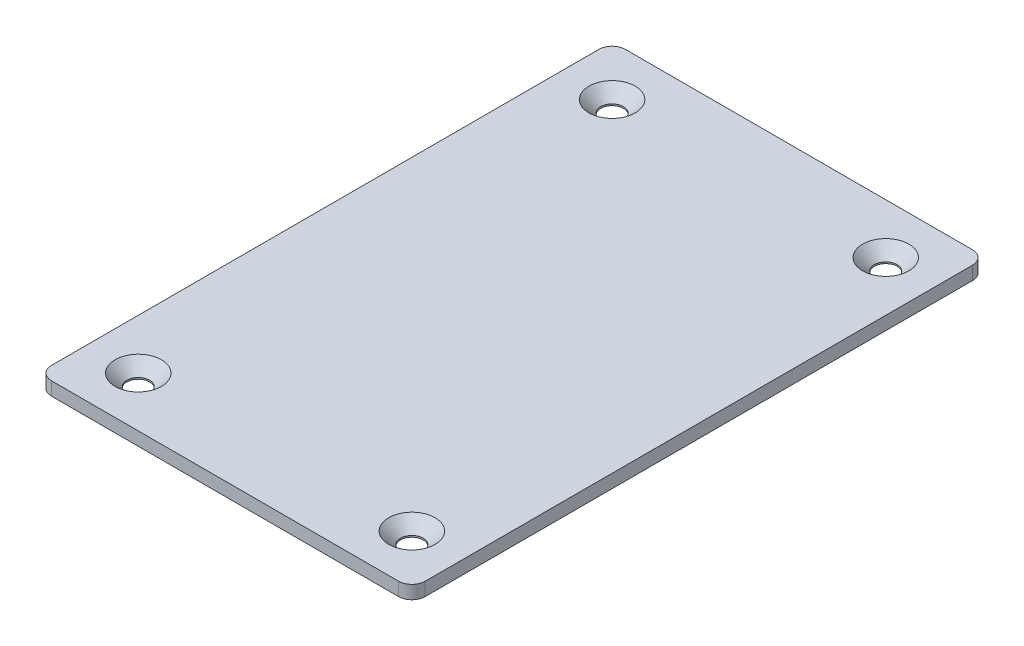
ISO-10303-21;
HEADER;
FILE_DESCRIPTION(('STEP AP214'),'2;1');
FILE_NAME('part.step','',(''),(''),'','','');
FILE_SCHEMA(('AUTOMOTIVE_DESIGN { 1 0 10303 214 1 1 1 1 }'));
ENDSEC;
DATA;
#1=APPLICATION_CONTEXT('core data for automotive mechanical design processes');
#2=APPLICATION_PROTOCOL_DEFINITION('international standard','automotive_design',2000,#1);
#3=PRODUCT_CONTEXT('',#1,'mechanical');
#4=PRODUCT('Part','Part','',(#3));
#5=PRODUCT_RELATED_PRODUCT_CATEGORY('part','',(#4));
#6=PRODUCT_DEFINITION_FORMATION('','',#4);
#7=PRODUCT_DEFINITION_CONTEXT('part definition',#1,'design');
#8=PRODUCT_DEFINITION('design','',#6,#7);
#9=PRODUCT_DEFINITION_SHAPE('','',#8);
#10=(LENGTH_UNIT() NAMED_UNIT(*) SI_UNIT(.MILLI.,.METRE.));
#11=(NAMED_UNIT(*) PLANE_ANGLE_UNIT() SI_UNIT($,.RADIAN.));
#12=(NAMED_UNIT(*) SI_UNIT($,.STERADIAN.) SOLID_ANGLE_UNIT());
#13=UNCERTAINTY_MEASURE_WITH_UNIT(LENGTH_MEASURE(1.E-05),#10,'distance_accuracy_value','');
#14=(GEOMETRIC_REPRESENTATION_CONTEXT(3) GLOBAL_UNCERTAINTY_ASSIGNED_CONTEXT((#13)) GLOBAL_UNIT_ASSIGNED_CONTEXT((#10,
#11,#12)) REPRESENTATION_CONTEXT('',''));
#15=CARTESIAN_POINT('',(0.,0.,0.));
#16=DIRECTION('',(0.,0.,1.));
#17=DIRECTION('',(1.,0.,0.));
#18=AXIS2_PLACEMENT_3D('',#15,#16,#17);
#19=CARTESIAN_POINT('',(0.,2.,0.));
#20=DIRECTION('',(0.,-1.,0.));
#21=DIRECTION('',(0.,0.,-1.));
#22=AXIS2_PLACEMENT_3D('',#19,#20,#21);
#23=PLANE('',#22);
#24=CARTESIAN_POINT('',(7.5,2.,-7.5));
#25=DIRECTION('',(0.,1.,0.));
#26=DIRECTION('',(0.,0.,1.));
#27=AXIS2_PLACEMENT_3D('',#24,#25,#26);
#28=CIRCLE('',#27,3.47);
#29=CARTESIAN_POINT('',(7.5,2.,-4.03));
#30=VERTEX_POINT('',#29);
#31=EDGE_CURVE('E213',#30,#30,#28,.T.);
#32=ORIENTED_EDGE('',*,*,#31,.F.);
#33=EDGE_LOOP('',(#32));
#34=FACE_BOUND('',#33,.T.);
#35=CARTESIAN_POINT('',(48.5,2.,-78.5));
#36=DIRECTION('',(0.,1.,0.));
#37=DIRECTION('',(0.,0.,1.));
#38=AXIS2_PLACEMENT_3D('',#35,#36,#37);
#39=CIRCLE('',#38,3.47);
#40=CARTESIAN_POINT('',(48.5,2.,-75.03));
#41=VERTEX_POINT('',#40);
#42=EDGE_CURVE('E204',#41,#41,#39,.T.);
#43=ORIENTED_EDGE('',*,*,#42,.F.);
#44=EDGE_LOOP('',(#43));
#45=FACE_BOUND('',#44,.T.);
#46=CARTESIAN_POINT('',(48.5,2.,-7.5));
#47=DIRECTION('',(0.,1.,0.));
#48=DIRECTION('',(0.,0.,1.));
#49=AXIS2_PLACEMENT_3D('',#46,#47,#48);
#50=CIRCLE('',#49,3.47);
#51=CARTESIAN_POINT('',(48.5,2.,-4.03));
#52=VERTEX_POINT('',#51);
#53=EDGE_CURVE('E186',#52,#52,#50,.T.);
#54=ORIENTED_EDGE('',*,*,#53,.F.);
#55=EDGE_LOOP('',(#54));
#56=FACE_BOUND('',#55,.T.);
#57=DIRECTION('',(-1.,0.,0.));
#58=VECTOR('',#57,1.);
#59=CARTESIAN_POINT('',(0.,2.,-86.));
#60=LINE('',#59,#58);
#61=CARTESIAN_POINT('',(54.,2.,-86.));
#62=VERTEX_POINT('',#61);
#63=CARTESIAN_POINT('',(2.,2.,-86.));
#64=VERTEX_POINT('',#63);
#65=EDGE_CURVE('E137',#62,#64,#60,.T.);
#66=ORIENTED_EDGE('',*,*,#65,.T.);
#67=CARTESIAN_POINT('',(2.,2.,-84.));
#68=DIRECTION('',(0.,-1.,0.));
#69=DIRECTION('',(0.,0.,-1.));
#70=AXIS2_PLACEMENT_3D('',#67,#68,#69);
#71=CIRCLE('',#70,2.);
#72=CARTESIAN_POINT('',(0.,2.,-84.));
#73=VERTEX_POINT('',#72);
#74=EDGE_CURVE('E155',#64,#73,#71,.F.);
#75=ORIENTED_EDGE('',*,*,#74,.T.);
#76=DIRECTION('',(0.,0.,1.));
#77=VECTOR('',#76,1.);
#78=CARTESIAN_POINT('',(0.,2.,0.));
#79=LINE('',#78,#77);
#80=CARTESIAN_POINT('',(0.,2.,-2.));
#81=VERTEX_POINT('',#80);
#82=EDGE_CURVE('E120',#73,#81,#79,.T.);
#83=ORIENTED_EDGE('',*,*,#82,.T.);
#84=CARTESIAN_POINT('',(2.,2.,-2.));
#85=DIRECTION('',(0.,-1.,0.));
#86=DIRECTION('',(0.,0.,-1.));
#87=AXIS2_PLACEMENT_3D('',#84,#85,#86);
#88=CIRCLE('',#87,2.);
#89=CARTESIAN_POINT('',(2.,2.,0.));
#90=VERTEX_POINT('',#89);
#91=EDGE_CURVE('E151',#81,#90,#88,.F.);
#92=ORIENTED_EDGE('',*,*,#91,.T.);
#93=DIRECTION('',(1.,0.,0.));
#94=VECTOR('',#93,1.);
#95=CARTESIAN_POINT('',(0.,2.,0.));
#96=LINE('',#95,#94);
#97=CARTESIAN_POINT('',(54.,2.,0.));
#98=VERTEX_POINT('',#97);
#99=EDGE_CURVE('E164',#90,#98,#96,.T.);
#100=ORIENTED_EDGE('',*,*,#99,.T.);
#101=CARTESIAN_POINT('',(54.,2.,-2.));
#102=DIRECTION('',(0.,-1.,0.));
#103=DIRECTION('',(0.,0.,-1.));
#104=AXIS2_PLACEMENT_3D('',#101,#102,#103);
#105=CIRCLE('',#104,2.);
#106=CARTESIAN_POINT('',(56.,2.,-2.));
#107=VERTEX_POINT('',#106);
#108=EDGE_CURVE('E55',#98,#107,#105,.F.);
#109=ORIENTED_EDGE('',*,*,#108,.T.);
#110=DIRECTION('',(0.,0.,-1.));
#111=VECTOR('',#110,1.);
#112=CARTESIAN_POINT('',(56.,2.,0.));
#113=LINE('',#112,#111);
#114=CARTESIAN_POINT('',(56.,2.,-84.));
#115=VERTEX_POINT('',#114);
#116=EDGE_CURVE('E170',#107,#115,#113,.T.);
#117=ORIENTED_EDGE('',*,*,#116,.T.);
#118=CARTESIAN_POINT('',(54.,2.,-84.));
#119=DIRECTION('',(0.,-1.,0.));
#120=DIRECTION('',(0.,0.,-1.));
#121=AXIS2_PLACEMENT_3D('',#118,#119,#120);
#122=CIRCLE('',#121,2.);
#123=EDGE_CURVE('E153',#115,#62,#122,.F.);
#124=ORIENTED_EDGE('',*,*,#123,.T.);
#125=EDGE_LOOP('',(#66,#75,#83,#92,#100,#109,#117,#124));
#126=FACE_BOUND('',#125,.T.);
#127=CARTESIAN_POINT('',(7.5,2.,-78.5));
#128=DIRECTION('',(0.,1.,0.));
#129=DIRECTION('',(0.,0.,1.));
#130=AXIS2_PLACEMENT_3D('',#127,#128,#129);
#131=CIRCLE('',#130,3.47);
#132=CARTESIAN_POINT('',(7.5,2.,-75.03));
#133=VERTEX_POINT('',#132);
#134=EDGE_CURVE('E195',#133,#133,#131,.T.);
#135=ORIENTED_EDGE('',*,*,#134,.F.);
#136=EDGE_LOOP('',(#135));
#137=FACE_BOUND('',#136,.T.);
#138=ADVANCED_FACE('F33',(#34,#45,#56,#126,#137),#23,.F.);
#139=CARTESIAN_POINT('',(0.,2.,0.));
#140=DIRECTION('',(1.,0.,0.));
#141=DIRECTION('',(0.,0.,-1.));
#142=AXIS2_PLACEMENT_3D('',#139,#140,#141);
#143=PLANE('',#142);
#144=ORIENTED_EDGE('',*,*,#82,.F.);
#145=DIRECTION('',(0.,-1.,0.));
#146=VECTOR('',#145,1.);
#147=CARTESIAN_POINT('',(0.,2.,-84.));
#148=LINE('',#147,#146);
#149=CARTESIAN_POINT('',(0.,0.,-84.));
#150=VERTEX_POINT('',#149);
#151=EDGE_CURVE('E104',#73,#150,#148,.T.);
#152=ORIENTED_EDGE('',*,*,#151,.T.);
#153=DIRECTION('',(0.,0.,1.));
#154=VECTOR('',#153,1.);
#155=CARTESIAN_POINT('',(0.,0.,0.));
#156=LINE('',#155,#154);
#157=CARTESIAN_POINT('',(0.,0.,-2.));
#158=VERTEX_POINT('',#157);
#159=EDGE_CURVE('E117',#150,#158,#156,.T.);
#160=ORIENTED_EDGE('',*,*,#159,.T.);
#161=DIRECTION('',(0.,-1.,0.));
#162=VECTOR('',#161,1.);
#163=CARTESIAN_POINT('',(0.,2.,-2.));
#164=LINE('',#163,#162);
#165=EDGE_CURVE('E122',#158,#81,#164,.F.);
#166=ORIENTED_EDGE('',*,*,#165,.T.);
#167=EDGE_LOOP('',(#144,#152,#160,#166));
#168=FACE_BOUND('',#167,.T.);
#169=ADVANCED_FACE('F116',(#168),#143,.F.);
#170=CARTESIAN_POINT('',(0.,2.,0.));
#171=DIRECTION('',(0.,0.,-1.));
#172=DIRECTION('',(-1.,0.,0.));
#173=AXIS2_PLACEMENT_3D('',#170,#171,#172);
#174=PLANE('',#173);
#175=ORIENTED_EDGE('',*,*,#99,.F.);
#176=DIRECTION('',(0.,-1.,0.));
#177=VECTOR('',#176,1.);
#178=CARTESIAN_POINT('',(2.,2.,0.));
#179=LINE('',#178,#177);
#180=CARTESIAN_POINT('',(2.,0.,0.));
#181=VERTEX_POINT('',#180);
#182=EDGE_CURVE('E11',#90,#181,#179,.T.);
#183=ORIENTED_EDGE('',*,*,#182,.T.);
#184=DIRECTION('',(1.,0.,0.));
#185=VECTOR('',#184,1.);
#186=CARTESIAN_POINT('',(0.,0.,0.));
#187=LINE('',#186,#185);
#188=CARTESIAN_POINT('',(54.,0.,0.));
#189=VERTEX_POINT('',#188);
#190=EDGE_CURVE('E127',#181,#189,#187,.T.);
#191=ORIENTED_EDGE('',*,*,#190,.T.);
#192=DIRECTION('',(0.,-1.,0.));
#193=VECTOR('',#192,1.);
#194=CARTESIAN_POINT('',(54.,2.,0.));
#195=LINE('',#194,#193);
#196=EDGE_CURVE('E41',#189,#98,#195,.F.);
#197=ORIENTED_EDGE('',*,*,#196,.T.);
#198=EDGE_LOOP('',(#175,#183,#191,#197));
#199=FACE_BOUND('',#198,.T.);
#200=ADVANCED_FACE('F163',(#199),#174,.F.);
#201=CARTESIAN_POINT('',(56.,2.,0.));
#202=DIRECTION('',(-1.,0.,0.));
#203=DIRECTION('',(0.,0.,1.));
#204=AXIS2_PLACEMENT_3D('',#201,#202,#203);
#205=PLANE('',#204);
#206=DIRECTION('',(0.,0.,-1.));
#207=VECTOR('',#206,1.);
#208=CARTESIAN_POINT('',(56.,0.,0.));
#209=LINE('',#208,#207);
#210=CARTESIAN_POINT('',(56.,0.,-2.));
#211=VERTEX_POINT('',#210);
#212=CARTESIAN_POINT('',(56.,0.,-84.));
#213=VERTEX_POINT('',#212);
#214=EDGE_CURVE('E131',#211,#213,#209,.T.);
#215=ORIENTED_EDGE('',*,*,#214,.T.);
#216=DIRECTION('',(0.,-1.,0.));
#217=VECTOR('',#216,1.);
#218=CARTESIAN_POINT('',(56.,2.,-84.));
#219=LINE('',#218,#217);
#220=EDGE_CURVE('E48',#213,#115,#219,.F.);
#221=ORIENTED_EDGE('',*,*,#220,.T.);
#222=ORIENTED_EDGE('',*,*,#116,.F.);
#223=DIRECTION('',(0.,-1.,0.));
#224=VECTOR('',#223,1.);
#225=CARTESIAN_POINT('',(56.,2.,-2.));
#226=LINE('',#225,#224);
#227=EDGE_CURVE('E157',#107,#211,#226,.T.);
#228=ORIENTED_EDGE('',*,*,#227,.T.);
#229=EDGE_LOOP('',(#215,#221,#222,#228));
#230=FACE_BOUND('',#229,.T.);
#231=ADVANCED_FACE('F174',(#230),#205,.F.);
#232=CARTESIAN_POINT('',(0.,2.,-86.));
#233=DIRECTION('',(0.,0.,1.));
#234=DIRECTION('',(1.,0.,0.));
#235=AXIS2_PLACEMENT_3D('',#232,#233,#234);
#236=PLANE('',#235);
#237=DIRECTION('',(-1.,0.,0.));
#238=VECTOR('',#237,1.);
#239=CARTESIAN_POINT('',(0.,0.,-86.));
#240=LINE('',#239,#238);
#241=CARTESIAN_POINT('',(54.,0.,-86.));
#242=VERTEX_POINT('',#241);
#243=CARTESIAN_POINT('',(2.,0.,-86.));
#244=VERTEX_POINT('',#243);
#245=EDGE_CURVE('E141',#242,#244,#240,.T.);
#246=ORIENTED_EDGE('',*,*,#245,.T.);
#247=DIRECTION('',(0.,-1.,0.));
#248=VECTOR('',#247,1.);
#249=CARTESIAN_POINT('',(2.,2.,-86.));
#250=LINE('',#249,#248);
#251=EDGE_CURVE('E105',#244,#64,#250,.F.);
#252=ORIENTED_EDGE('',*,*,#251,.T.);
#253=ORIENTED_EDGE('',*,*,#65,.F.);
#254=DIRECTION('',(0.,-1.,0.));
#255=VECTOR('',#254,1.);
#256=CARTESIAN_POINT('',(54.,2.,-86.));
#257=LINE('',#256,#255);
#258=EDGE_CURVE('E110',#62,#242,#257,.T.);
#259=ORIENTED_EDGE('',*,*,#258,.T.);
#260=EDGE_LOOP('',(#246,#252,#253,#259));
#261=FACE_BOUND('',#260,.T.);
#262=ADVANCED_FACE('F181',(#261),#236,.F.);
#263=CARTESIAN_POINT('',(0.,0.,0.));
#264=DIRECTION('',(0.,-1.,0.));
#265=DIRECTION('',(0.,0.,-1.));
#266=AXIS2_PLACEMENT_3D('',#263,#264,#265);
#267=PLANE('',#266);
#268=CARTESIAN_POINT('',(7.5,0.,-7.5));
#269=DIRECTION('',(0.,1.,0.));
#270=DIRECTION('',(0.,0.,1.));
#271=AXIS2_PLACEMENT_3D('',#268,#269,#270);
#272=CIRCLE('',#271,1.7);
#273=CARTESIAN_POINT('',(7.5,0.,-5.8));
#274=VERTEX_POINT('',#273);
#275=EDGE_CURVE('E207',#274,#274,#272,.T.);
#276=ORIENTED_EDGE('',*,*,#275,.T.);
#277=EDGE_LOOP('',(#276));
#278=FACE_BOUND('',#277,.T.);
#279=CARTESIAN_POINT('',(48.5,0.,-78.5));
#280=DIRECTION('',(0.,1.,0.));
#281=DIRECTION('',(0.,0.,1.));
#282=AXIS2_PLACEMENT_3D('',#279,#280,#281);
#283=CIRCLE('',#282,1.7);
#284=CARTESIAN_POINT('',(48.5,0.,-76.8));
#285=VERTEX_POINT('',#284);
#286=EDGE_CURVE('E198',#285,#285,#283,.T.);
#287=ORIENTED_EDGE('',*,*,#286,.T.);
#288=EDGE_LOOP('',(#287));
#289=FACE_BOUND('',#288,.T.);
#290=CARTESIAN_POINT('',(7.5,0.,-78.5));
#291=DIRECTION('',(0.,1.,0.));
#292=DIRECTION('',(0.,0.,1.));
#293=AXIS2_PLACEMENT_3D('',#290,#291,#292);
#294=CIRCLE('',#293,1.7);
#295=CARTESIAN_POINT('',(7.5,0.,-76.8));
#296=VERTEX_POINT('',#295);
#297=EDGE_CURVE('E189',#296,#296,#294,.T.);
#298=ORIENTED_EDGE('',*,*,#297,.T.);
#299=EDGE_LOOP('',(#298));
#300=FACE_BOUND('',#299,.T.);
#301=CARTESIAN_POINT('',(48.5,0.,-7.5));
#302=DIRECTION('',(0.,1.,0.));
#303=DIRECTION('',(0.,0.,1.));
#304=AXIS2_PLACEMENT_3D('',#301,#302,#303);
#305=CIRCLE('',#304,1.7);
#306=CARTESIAN_POINT('',(48.5,0.,-5.8));
#307=VERTEX_POINT('',#306);
#308=EDGE_CURVE('E128',#307,#307,#305,.T.);
#309=ORIENTED_EDGE('',*,*,#308,.T.);
#310=EDGE_LOOP('',(#309));
#311=FACE_BOUND('',#310,.T.);
#312=ORIENTED_EDGE('',*,*,#159,.F.);
#313=CARTESIAN_POINT('',(2.,0.,-84.));
#314=DIRECTION('',(0.,-1.,0.));
#315=DIRECTION('',(0.,0.,-1.));
#316=AXIS2_PLACEMENT_3D('',#313,#314,#315);
#317=CIRCLE('',#316,2.);
#318=EDGE_CURVE('E100',#150,#244,#317,.T.);
#319=ORIENTED_EDGE('',*,*,#318,.T.);
#320=ORIENTED_EDGE('',*,*,#245,.F.);
#321=CARTESIAN_POINT('',(54.,0.,-84.));
#322=DIRECTION('',(0.,-1.,0.));
#323=DIRECTION('',(0.,0.,-1.));
#324=AXIS2_PLACEMENT_3D('',#321,#322,#323);
#325=CIRCLE('',#324,2.);
#326=EDGE_CURVE('E111',#242,#213,#325,.T.);
#327=ORIENTED_EDGE('',*,*,#326,.T.);
#328=ORIENTED_EDGE('',*,*,#214,.F.);
#329=CARTESIAN_POINT('',(54.,0.,-2.));
#330=DIRECTION('',(0.,-1.,0.));
#331=DIRECTION('',(0.,0.,-1.));
#332=AXIS2_PLACEMENT_3D('',#329,#330,#331);
#333=CIRCLE('',#332,2.);
#334=EDGE_CURVE('E121',#211,#189,#333,.T.);
#335=ORIENTED_EDGE('',*,*,#334,.T.);
#336=ORIENTED_EDGE('',*,*,#190,.F.);
#337=CARTESIAN_POINT('',(2.,0.,-2.));
#338=DIRECTION('',(0.,-1.,0.));
#339=DIRECTION('',(0.,0.,-1.));
#340=AXIS2_PLACEMENT_3D('',#337,#338,#339);
#341=CIRCLE('',#340,2.);
#342=EDGE_CURVE('E126',#181,#158,#341,.T.);
#343=ORIENTED_EDGE('',*,*,#342,.T.);
#344=EDGE_LOOP('',(#312,#319,#320,#327,#328,#335,#336,#343));
#345=FACE_BOUND('',#344,.T.);
#346=ADVANCED_FACE('F124',(#278,#289,#300,#311,#345),#267,.T.);
#347=CARTESIAN_POINT('',(2.,2.,-84.));
#348=DIRECTION('',(0.,-1.,0.));
#349=DIRECTION('',(0.,0.,-1.));
#350=AXIS2_PLACEMENT_3D('',#347,#348,#349);
#351=CYLINDRICAL_SURFACE('',#350,2.);
#352=ORIENTED_EDGE('',*,*,#74,.F.);
#353=ORIENTED_EDGE('',*,*,#251,.F.);
#354=ORIENTED_EDGE('',*,*,#318,.F.);
#355=ORIENTED_EDGE('',*,*,#151,.F.);
#356=EDGE_LOOP('',(#352,#353,#354,#355));
#357=FACE_BOUND('',#356,.T.);
#358=ADVANCED_FACE('F103',(#357),#351,.T.);
#359=CARTESIAN_POINT('',(54.,2.,-84.));
#360=DIRECTION('',(0.,-1.,0.));
#361=DIRECTION('',(0.,0.,-1.));
#362=AXIS2_PLACEMENT_3D('',#359,#360,#361);
#363=CYLINDRICAL_SURFACE('',#362,2.);
#364=ORIENTED_EDGE('',*,*,#123,.F.);
#365=ORIENTED_EDGE('',*,*,#220,.F.);
#366=ORIENTED_EDGE('',*,*,#326,.F.);
#367=ORIENTED_EDGE('',*,*,#258,.F.);
#368=EDGE_LOOP('',(#364,#365,#366,#367));
#369=FACE_BOUND('',#368,.T.);
#370=ADVANCED_FACE('F178',(#369),#363,.T.);
#371=CARTESIAN_POINT('',(2.,2.,-2.));
#372=DIRECTION('',(0.,-1.,0.));
#373=DIRECTION('',(0.,0.,-1.));
#374=AXIS2_PLACEMENT_3D('',#371,#372,#373);
#375=CYLINDRICAL_SURFACE('',#374,2.);
#376=ORIENTED_EDGE('',*,*,#91,.F.);
#377=ORIENTED_EDGE('',*,*,#165,.F.);
#378=ORIENTED_EDGE('',*,*,#342,.F.);
#379=ORIENTED_EDGE('',*,*,#182,.F.);
#380=EDGE_LOOP('',(#376,#377,#378,#379));
#381=FACE_BOUND('',#380,.T.);
#382=ADVANCED_FACE('F258',(#381),#375,.T.);
#383=CARTESIAN_POINT('',(54.,2.,-2.));
#384=DIRECTION('',(0.,-1.,0.));
#385=DIRECTION('',(0.,0.,-1.));
#386=AXIS2_PLACEMENT_3D('',#383,#384,#385);
#387=CYLINDRICAL_SURFACE('',#386,2.);
#388=ORIENTED_EDGE('',*,*,#108,.F.);
#389=ORIENTED_EDGE('',*,*,#196,.F.);
#390=ORIENTED_EDGE('',*,*,#334,.F.);
#391=ORIENTED_EDGE('',*,*,#227,.F.);
#392=EDGE_LOOP('',(#388,#389,#390,#391));
#393=FACE_BOUND('',#392,.T.);
#394=ADVANCED_FACE('F35',(#393),#387,.T.);
#395=CARTESIAN_POINT('',(48.5,2.,-7.5));
#396=DIRECTION('',(0.,1.,0.));
#397=DIRECTION('',(0.,0.,1.));
#398=AXIS2_PLACEMENT_3D('',#395,#396,#397);
#399=CYLINDRICAL_SURFACE('',#398,1.7);
#400=ORIENTED_EDGE('',*,*,#308,.F.);
#401=EDGE_LOOP('',(#400));
#402=FACE_BOUND('',#401,.T.);
#403=CARTESIAN_POINT('',(48.5,0.229999999999998,-7.5));
#404=DIRECTION('',(0.,1.,0.));
#405=DIRECTION('',(0.,0.,1.));
#406=AXIS2_PLACEMENT_3D('',#403,#404,#405);
#407=CIRCLE('',#406,1.7);
#408=CARTESIAN_POINT('',(48.5,0.229999999999998,-5.8));
#409=VERTEX_POINT('',#408);
#410=EDGE_CURVE('E134',#409,#409,#407,.T.);
#411=ORIENTED_EDGE('',*,*,#410,.T.);
#412=EDGE_LOOP('',(#411));
#413=FACE_BOUND('',#412,.T.);
#414=ADVANCED_FACE('F229',(#402,#413),#399,.F.);
#415=CARTESIAN_POINT('',(48.5,2.,-7.5));
#416=DIRECTION('',(0.,1.,0.));
#417=DIRECTION('',(0.,0.,1.));
#418=AXIS2_PLACEMENT_3D('',#415,#416,#417);
#419=CONICAL_SURFACE('',#418,3.47,0.785398163397448);
#420=ORIENTED_EDGE('',*,*,#410,.F.);
#421=EDGE_LOOP('',(#420));
#422=FACE_BOUND('',#421,.T.);
#423=ORIENTED_EDGE('',*,*,#53,.T.);
#424=EDGE_LOOP('',(#423));
#425=FACE_BOUND('',#424,.T.);
#426=ADVANCED_FACE('F226',(#422,#425),#419,.F.);
#427=CARTESIAN_POINT('',(7.5,2.,-78.5));
#428=DIRECTION('',(0.,1.,0.));
#429=DIRECTION('',(0.,0.,1.));
#430=AXIS2_PLACEMENT_3D('',#427,#428,#429);
#431=CYLINDRICAL_SURFACE('',#430,1.7);
#432=ORIENTED_EDGE('',*,*,#297,.F.);
#433=EDGE_LOOP('',(#432));
#434=FACE_BOUND('',#433,.T.);
#435=CARTESIAN_POINT('',(7.5,0.229999999999998,-78.5));
#436=DIRECTION('',(0.,1.,0.));
#437=DIRECTION('',(0.,0.,1.));
#438=AXIS2_PLACEMENT_3D('',#435,#436,#437);
#439=CIRCLE('',#438,1.7);
#440=CARTESIAN_POINT('',(7.5,0.229999999999998,-76.8));
#441=VERTEX_POINT('',#440);
#442=EDGE_CURVE('E192',#441,#441,#439,.T.);
#443=ORIENTED_EDGE('',*,*,#442,.T.);
#444=EDGE_LOOP('',(#443));
#445=FACE_BOUND('',#444,.T.);
#446=ADVANCED_FACE('F228',(#434,#445),#431,.F.);
#447=CARTESIAN_POINT('',(7.5,2.,-78.5));
#448=DIRECTION('',(0.,1.,0.));
#449=DIRECTION('',(0.,0.,1.));
#450=AXIS2_PLACEMENT_3D('',#447,#448,#449);
#451=CONICAL_SURFACE('',#450,3.47,0.785398163397449);
#452=ORIENTED_EDGE('',*,*,#442,.F.);
#453=EDGE_LOOP('',(#452));
#454=FACE_BOUND('',#453,.T.);
#455=ORIENTED_EDGE('',*,*,#134,.T.);
#456=EDGE_LOOP('',(#455));
#457=FACE_BOUND('',#456,.T.);
#458=ADVANCED_FACE('F236',(#454,#457),#451,.F.);
#459=CARTESIAN_POINT('',(48.5,2.,-78.5));
#460=DIRECTION('',(0.,1.,0.));
#461=DIRECTION('',(0.,0.,1.));
#462=AXIS2_PLACEMENT_3D('',#459,#460,#461);
#463=CYLINDRICAL_SURFACE('',#462,1.7);
#464=ORIENTED_EDGE('',*,*,#286,.F.);
#465=EDGE_LOOP('',(#464));
#466=FACE_BOUND('',#465,.T.);
#467=CARTESIAN_POINT('',(48.5,0.229999999999998,-78.5));
#468=DIRECTION('',(0.,1.,0.));
#469=DIRECTION('',(0.,0.,1.));
#470=AXIS2_PLACEMENT_3D('',#467,#468,#469);
#471=CIRCLE('',#470,1.7);
#472=CARTESIAN_POINT('',(48.5,0.229999999999998,-76.8));
#473=VERTEX_POINT('',#472);
#474=EDGE_CURVE('E201',#473,#473,#471,.T.);
#475=ORIENTED_EDGE('',*,*,#474,.T.);
#476=EDGE_LOOP('',(#475));
#477=FACE_BOUND('',#476,.T.);
#478=ADVANCED_FACE('F294',(#466,#477),#463,.F.);
#479=CARTESIAN_POINT('',(48.5,2.,-78.5));
#480=DIRECTION('',(0.,1.,0.));
#481=DIRECTION('',(0.,0.,1.));
#482=AXIS2_PLACEMENT_3D('',#479,#480,#481);
#483=CONICAL_SURFACE('',#482,3.47,0.785398163397448);
#484=ORIENTED_EDGE('',*,*,#474,.F.);
#485=EDGE_LOOP('',(#484));
#486=FACE_BOUND('',#485,.T.);
#487=ORIENTED_EDGE('',*,*,#42,.T.);
#488=EDGE_LOOP('',(#487));
#489=FACE_BOUND('',#488,.T.);
#490=ADVANCED_FACE('F303',(#486,#489),#483,.F.);
#491=CARTESIAN_POINT('',(7.5,2.,-7.5));
#492=DIRECTION('',(0.,1.,0.));
#493=DIRECTION('',(0.,0.,1.));
#494=AXIS2_PLACEMENT_3D('',#491,#492,#493);
#495=CYLINDRICAL_SURFACE('',#494,1.7);
#496=ORIENTED_EDGE('',*,*,#275,.F.);
#497=EDGE_LOOP('',(#496));
#498=FACE_BOUND('',#497,.T.);
#499=CARTESIAN_POINT('',(7.5,0.229999999999998,-7.5));
#500=DIRECTION('',(0.,1.,0.));
#501=DIRECTION('',(0.,0.,1.));
#502=AXIS2_PLACEMENT_3D('',#499,#500,#501);
#503=CIRCLE('',#502,1.7);
#504=CARTESIAN_POINT('',(7.5,0.229999999999998,-5.8));
#505=VERTEX_POINT('',#504);
#506=EDGE_CURVE('E210',#505,#505,#503,.T.);
#507=ORIENTED_EDGE('',*,*,#506,.T.);
#508=EDGE_LOOP('',(#507));
#509=FACE_BOUND('',#508,.T.);
#510=ADVANCED_FACE('F313',(#498,#509),#495,.F.);
#511=CARTESIAN_POINT('',(7.5,2.,-7.5));
#512=DIRECTION('',(0.,1.,0.));
#513=DIRECTION('',(0.,0.,1.));
#514=AXIS2_PLACEMENT_3D('',#511,#512,#513);
#515=CONICAL_SURFACE('',#514,3.47,0.785398163397449);
#516=ORIENTED_EDGE('',*,*,#506,.F.);
#517=EDGE_LOOP('',(#516));
#518=FACE_BOUND('',#517,.T.);
#519=ORIENTED_EDGE('',*,*,#31,.T.);
#520=EDGE_LOOP('',(#519));
#521=FACE_BOUND('',#520,.T.);
#522=ADVANCED_FACE('F217',(#518,#521),#515,.F.);
#523=CLOSED_SHELL('',(#138,#169,#200,#231,#262,#346,#358,#370,#382,#394,#414,#426,#446,#458,
#478,#490,#510,#522));
#524=MANIFOLD_SOLID_BREP('B2',#523);
#525=ADVANCED_BREP_SHAPE_REPRESENTATION('',(#18,#524),#14);
#526=SHAPE_DEFINITION_REPRESENTATION(#9,#525);
ENDSEC;
END-ISO-10303-21;
